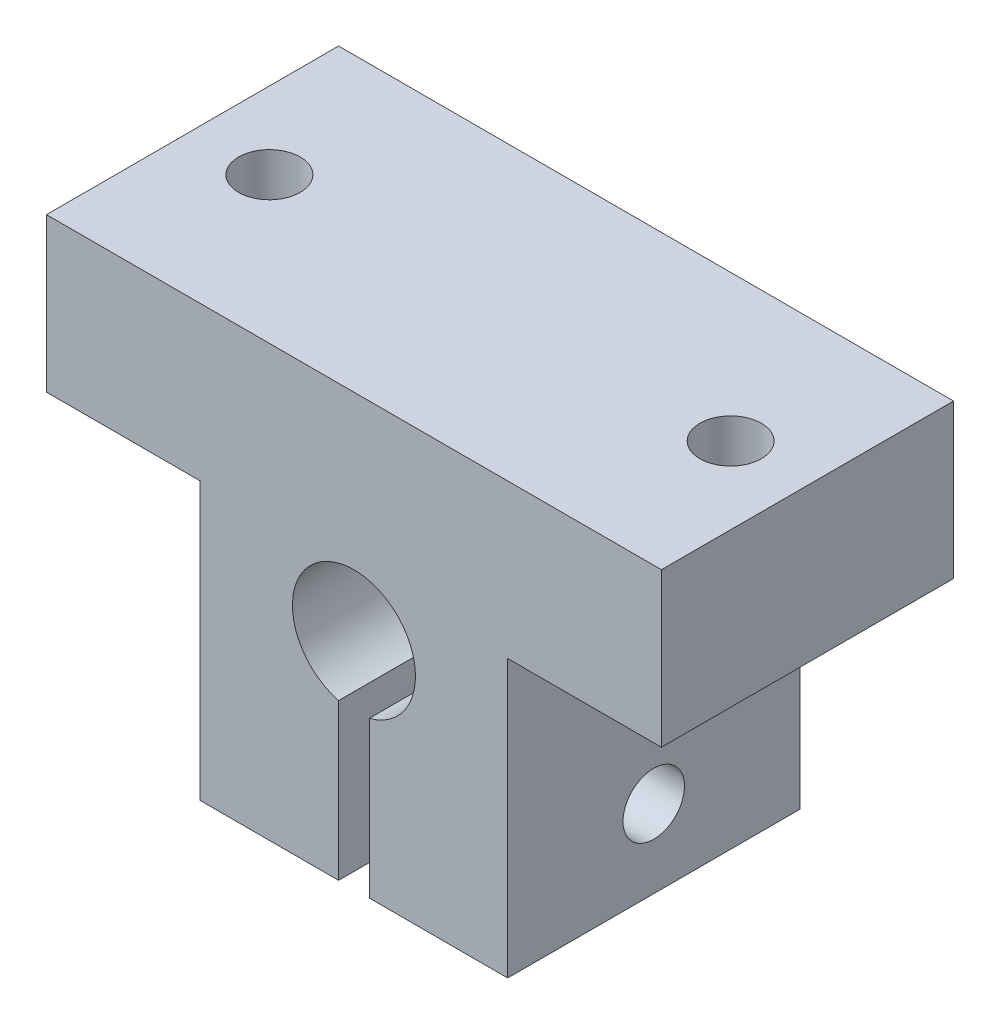
ISO-10303-21;
HEADER;
FILE_DESCRIPTION(('STEP AP214'),'2;1');
FILE_NAME('part.step','',(''),(''),'','','');
FILE_SCHEMA(('AUTOMOTIVE_DESIGN { 1 0 10303 214 1 1 1 1 }'));
ENDSEC;
DATA;
#1=APPLICATION_CONTEXT('core data for automotive mechanical design processes');
#2=APPLICATION_PROTOCOL_DEFINITION('international standard','automotive_design',2000,#1);
#3=PRODUCT_CONTEXT('',#1,'mechanical');
#4=PRODUCT('Part','Part','',(#3));
#5=PRODUCT_RELATED_PRODUCT_CATEGORY('part','',(#4));
#6=PRODUCT_DEFINITION_FORMATION('','',#4);
#7=PRODUCT_DEFINITION_CONTEXT('part definition',#1,'design');
#8=PRODUCT_DEFINITION('design','',#6,#7);
#9=PRODUCT_DEFINITION_SHAPE('','',#8);
#10=(LENGTH_UNIT() NAMED_UNIT(*) SI_UNIT(.MILLI.,.METRE.));
#11=(NAMED_UNIT(*) PLANE_ANGLE_UNIT() SI_UNIT($,.RADIAN.));
#12=(NAMED_UNIT(*) SI_UNIT($,.STERADIAN.) SOLID_ANGLE_UNIT());
#13=UNCERTAINTY_MEASURE_WITH_UNIT(LENGTH_MEASURE(1.E-05),#10,'distance_accuracy_value','');
#14=(GEOMETRIC_REPRESENTATION_CONTEXT(3) GLOBAL_UNCERTAINTY_ASSIGNED_CONTEXT((#13)) GLOBAL_UNIT_ASSIGNED_CONTEXT((#10,
#11,#12)) REPRESENTATION_CONTEXT('',''));
#15=CARTESIAN_POINT('',(0.,0.,0.));
#16=DIRECTION('',(0.,0.,1.));
#17=DIRECTION('',(1.,0.,0.));
#18=AXIS2_PLACEMENT_3D('',#15,#16,#17);
#19=CARTESIAN_POINT('',(80.0000000000009,-28.,19.));
#20=DIRECTION('',(0.,1.,0.));
#21=DIRECTION('',(-1.,0.,0.));
#22=AXIS2_PLACEMENT_3D('',#19,#20,#21);
#23=PLANE('',#22);
#24=DIRECTION('',(1.,0.,0.));
#25=VECTOR('',#24,1.);
#26=CARTESIAN_POINT('',(80.0000000000009,-28.,19.));
#27=LINE('',#26,#25);
#28=CARTESIAN_POINT('',(71.0000000000009,-28.,19.));
#29=VERTEX_POINT('',#28);
#30=CARTESIAN_POINT('',(80.0000000000009,-28.,19.));
#31=VERTEX_POINT('',#30);
#32=EDGE_CURVE('E241',#29,#31,#27,.T.);
#33=ORIENTED_EDGE('',*,*,#32,.F.);
#34=DIRECTION('',(0.,0.,-1.));
#35=VECTOR('',#34,1.);
#36=CARTESIAN_POINT('',(71.0000000000009,-28.,19.));
#37=LINE('',#36,#35);
#38=CARTESIAN_POINT('',(71.0000000000009,-28.,0.));
#39=VERTEX_POINT('',#38);
#40=EDGE_CURVE('E136',#29,#39,#37,.T.);
#41=ORIENTED_EDGE('',*,*,#40,.T.);
#42=DIRECTION('',(1.,0.,0.));
#43=VECTOR('',#42,1.);
#44=CARTESIAN_POINT('',(80.0000000000009,-28.,0.));
#45=LINE('',#44,#43);
#46=CARTESIAN_POINT('',(80.0000000000009,-28.,0.));
#47=VERTEX_POINT('',#46);
#48=EDGE_CURVE('E156',#39,#47,#45,.T.);
#49=ORIENTED_EDGE('',*,*,#48,.T.);
#50=DIRECTION('',(0.,0.,-1.));
#51=VECTOR('',#50,1.);
#52=CARTESIAN_POINT('',(80.0000000000009,-28.,19.));
#53=LINE('',#52,#51);
#54=EDGE_CURVE('E178',#31,#47,#53,.T.);
#55=ORIENTED_EDGE('',*,*,#54,.F.);
#56=EDGE_LOOP('',(#33,#41,#49,#55));
#57=FACE_BOUND('',#56,.T.);
#58=ADVANCED_FACE('F39',(#57),#23,.F.);
#59=CARTESIAN_POINT('',(0.,0.,19.));
#60=DIRECTION('',(0.,0.,-1.));
#61=DIRECTION('',(-1.,0.,0.));
#62=AXIS2_PLACEMENT_3D('',#59,#60,#61);
#63=PLANE('',#62);
#64=CARTESIAN_POINT('',(70.0000000000009,-14.,19.));
#65=DIRECTION('',(0.,0.,1.));
#66=DIRECTION('',(1.,0.,0.));
#67=AXIS2_PLACEMENT_3D('',#64,#65,#66);
#68=CIRCLE('',#67,4.00000000000001);
#69=CARTESIAN_POINT('',(71.0000000000009,-17.8729833462074,19.));
#70=VERTEX_POINT('',#69);
#71=CARTESIAN_POINT('',(69.0000000000009,-17.8729833462074,19.));
#72=VERTEX_POINT('',#71);
#73=EDGE_CURVE('E206',#70,#72,#68,.T.);
#74=ORIENTED_EDGE('',*,*,#73,.F.);
#75=DIRECTION('',(0.,1.,0.));
#76=VECTOR('',#75,1.);
#77=CARTESIAN_POINT('',(71.0000000000009,-40.7761479722693,19.));
#78=LINE('',#77,#76);
#79=EDGE_CURVE('E63',#29,#70,#78,.T.);
#80=ORIENTED_EDGE('',*,*,#79,.F.);
#81=ORIENTED_EDGE('',*,*,#32,.T.);
#82=DIRECTION('',(0.,1.,0.));
#83=VECTOR('',#82,1.);
#84=CARTESIAN_POINT('',(80.0000000000009,-10.,19.));
#85=LINE('',#84,#83);
#86=CARTESIAN_POINT('',(80.0000000000009,-10.,19.));
#87=VERTEX_POINT('',#86);
#88=EDGE_CURVE('E244',#31,#87,#85,.T.);
#89=ORIENTED_EDGE('',*,*,#88,.T.);
#90=DIRECTION('',(1.,0.,0.));
#91=VECTOR('',#90,1.);
#92=CARTESIAN_POINT('',(90.0000000000009,-10.,19.));
#93=LINE('',#92,#91);
#94=CARTESIAN_POINT('',(90.0000000000009,-10.,19.));
#95=VERTEX_POINT('',#94);
#96=EDGE_CURVE('E174',#87,#95,#93,.T.);
#97=ORIENTED_EDGE('',*,*,#96,.T.);
#98=DIRECTION('',(0.,1.,0.));
#99=VECTOR('',#98,1.);
#100=CARTESIAN_POINT('',(90.0000000000009,0.,19.));
#101=LINE('',#100,#99);
#102=CARTESIAN_POINT('',(90.0000000000009,0.,19.));
#103=VERTEX_POINT('',#102);
#104=EDGE_CURVE('E168',#95,#103,#101,.T.);
#105=ORIENTED_EDGE('',*,*,#104,.T.);
#106=DIRECTION('',(-1.,0.,0.));
#107=VECTOR('',#106,1.);
#108=CARTESIAN_POINT('',(50.0000000000009,0.,19.));
#109=LINE('',#108,#107);
#110=CARTESIAN_POINT('',(50.0000000000009,0.,19.));
#111=VERTEX_POINT('',#110);
#112=EDGE_CURVE('E229',#103,#111,#109,.T.);
#113=ORIENTED_EDGE('',*,*,#112,.T.);
#114=DIRECTION('',(0.,-1.,0.));
#115=VECTOR('',#114,1.);
#116=CARTESIAN_POINT('',(50.0000000000009,0.,19.));
#117=LINE('',#116,#115);
#118=CARTESIAN_POINT('',(50.0000000000009,-10.,19.));
#119=VERTEX_POINT('',#118);
#120=EDGE_CURVE('E232',#111,#119,#117,.T.);
#121=ORIENTED_EDGE('',*,*,#120,.T.);
#122=DIRECTION('',(1.,0.,0.));
#123=VECTOR('',#122,1.);
#124=CARTESIAN_POINT('',(60.0000000000009,-10.,19.));
#125=LINE('',#124,#123);
#126=CARTESIAN_POINT('',(60.0000000000009,-10.,19.));
#127=VERTEX_POINT('',#126);
#128=EDGE_CURVE('E235',#119,#127,#125,.T.);
#129=ORIENTED_EDGE('',*,*,#128,.T.);
#130=DIRECTION('',(0.,-1.,0.));
#131=VECTOR('',#130,1.);
#132=CARTESIAN_POINT('',(60.0000000000009,-28.,19.));
#133=LINE('',#132,#131);
#134=CARTESIAN_POINT('',(60.0000000000009,-28.,19.));
#135=VERTEX_POINT('',#134);
#136=EDGE_CURVE('E238',#127,#135,#133,.T.);
#137=ORIENTED_EDGE('',*,*,#136,.T.);
#138=CARTESIAN_POINT('',(69.0000000000009,-28.,19.));
#139=VERTEX_POINT('',#138);
#140=EDGE_CURVE('E207',#135,#139,#27,.T.);
#141=ORIENTED_EDGE('',*,*,#140,.T.);
#142=DIRECTION('',(0.,-1.,0.));
#143=VECTOR('',#142,1.);
#144=CARTESIAN_POINT('',(69.0000000000009,-40.7761479722693,19.));
#145=LINE('',#144,#143);
#146=EDGE_CURVE('E130',#72,#139,#145,.T.);
#147=ORIENTED_EDGE('',*,*,#146,.F.);
#148=EDGE_LOOP('',(#74,#80,#81,#89,#97,#105,#113,#121,#129,#137,#141,#147));
#149=FACE_BOUND('',#148,.T.);
#150=ADVANCED_FACE('F205',(#149),#63,.F.);
#151=CARTESIAN_POINT('',(0.,0.,0.));
#152=DIRECTION('',(0.,0.,-1.));
#153=DIRECTION('',(-1.,0.,0.));
#154=AXIS2_PLACEMENT_3D('',#151,#152,#153);
#155=PLANE('',#154);
#156=DIRECTION('',(0.,1.,0.));
#157=VECTOR('',#156,1.);
#158=CARTESIAN_POINT('',(71.0000000000009,-40.7761479722693,0.));
#159=LINE('',#158,#157);
#160=CARTESIAN_POINT('',(71.0000000000009,-17.8729833462074,0.));
#161=VERTEX_POINT('',#160);
#162=EDGE_CURVE('E148',#39,#161,#159,.T.);
#163=ORIENTED_EDGE('',*,*,#162,.T.);
#164=CARTESIAN_POINT('',(70.0000000000009,-14.,0.));
#165=DIRECTION('',(0.,0.,1.));
#166=DIRECTION('',(1.,0.,0.));
#167=AXIS2_PLACEMENT_3D('',#164,#165,#166);
#168=CIRCLE('',#167,4.00000000000001);
#169=CARTESIAN_POINT('',(69.0000000000009,-17.8729833462074,0.));
#170=VERTEX_POINT('',#169);
#171=EDGE_CURVE('E146',#161,#170,#168,.T.);
#172=ORIENTED_EDGE('',*,*,#171,.T.);
#173=DIRECTION('',(0.,-1.,0.));
#174=VECTOR('',#173,1.);
#175=CARTESIAN_POINT('',(69.0000000000009,-40.7761479722693,0.));
#176=LINE('',#175,#174);
#177=CARTESIAN_POINT('',(69.0000000000009,-28.,0.));
#178=VERTEX_POINT('',#177);
#179=EDGE_CURVE('E56',#170,#178,#176,.T.);
#180=ORIENTED_EDGE('',*,*,#179,.T.);
#181=CARTESIAN_POINT('',(60.0000000000009,-28.,0.));
#182=VERTEX_POINT('',#181);
#183=EDGE_CURVE('E144',#182,#178,#45,.T.);
#184=ORIENTED_EDGE('',*,*,#183,.F.);
#185=DIRECTION('',(0.,-1.,0.));
#186=VECTOR('',#185,1.);
#187=CARTESIAN_POINT('',(60.0000000000009,-28.,0.));
#188=LINE('',#187,#186);
#189=CARTESIAN_POINT('',(60.0000000000009,-10.,0.));
#190=VERTEX_POINT('',#189);
#191=EDGE_CURVE('E162',#190,#182,#188,.T.);
#192=ORIENTED_EDGE('',*,*,#191,.F.);
#193=DIRECTION('',(1.,0.,0.));
#194=VECTOR('',#193,1.);
#195=CARTESIAN_POINT('',(60.0000000000009,-10.,0.));
#196=LINE('',#195,#194);
#197=CARTESIAN_POINT('',(50.0000000000009,-10.,0.));
#198=VERTEX_POINT('',#197);
#199=EDGE_CURVE('E253',#198,#190,#196,.T.);
#200=ORIENTED_EDGE('',*,*,#199,.F.);
#201=DIRECTION('',(0.,-1.,0.));
#202=VECTOR('',#201,1.);
#203=CARTESIAN_POINT('',(50.0000000000009,0.,0.));
#204=LINE('',#203,#202);
#205=CARTESIAN_POINT('',(50.0000000000009,0.,0.));
#206=VERTEX_POINT('',#205);
#207=EDGE_CURVE('E251',#206,#198,#204,.T.);
#208=ORIENTED_EDGE('',*,*,#207,.F.);
#209=DIRECTION('',(-1.,0.,0.));
#210=VECTOR('',#209,1.);
#211=CARTESIAN_POINT('',(50.0000000000009,0.,0.));
#212=LINE('',#211,#210);
#213=CARTESIAN_POINT('',(90.0000000000009,0.,0.));
#214=VERTEX_POINT('',#213);
#215=EDGE_CURVE('E218',#214,#206,#212,.T.);
#216=ORIENTED_EDGE('',*,*,#215,.F.);
#217=DIRECTION('',(0.,1.,0.));
#218=VECTOR('',#217,1.);
#219=CARTESIAN_POINT('',(90.0000000000009,0.,0.));
#220=LINE('',#219,#218);
#221=CARTESIAN_POINT('',(90.0000000000009,-10.,0.));
#222=VERTEX_POINT('',#221);
#223=EDGE_CURVE('E213',#222,#214,#220,.T.);
#224=ORIENTED_EDGE('',*,*,#223,.F.);
#225=DIRECTION('',(1.,0.,0.));
#226=VECTOR('',#225,1.);
#227=CARTESIAN_POINT('',(90.0000000000009,-10.,0.));
#228=LINE('',#227,#226);
#229=CARTESIAN_POINT('',(80.0000000000009,-10.,0.));
#230=VERTEX_POINT('',#229);
#231=EDGE_CURVE('E160',#230,#222,#228,.T.);
#232=ORIENTED_EDGE('',*,*,#231,.F.);
#233=DIRECTION('',(0.,1.,0.));
#234=VECTOR('',#233,1.);
#235=CARTESIAN_POINT('',(80.0000000000009,-10.,0.));
#236=LINE('',#235,#234);
#237=EDGE_CURVE('E155',#47,#230,#236,.T.);
#238=ORIENTED_EDGE('',*,*,#237,.F.);
#239=ORIENTED_EDGE('',*,*,#48,.F.);
#240=EDGE_LOOP('',(#163,#172,#180,#184,#192,#200,#208,#216,#224,#232,#238,#239));
#241=FACE_BOUND('',#240,.T.);
#242=ADVANCED_FACE('F142',(#241),#155,.T.);
#243=CARTESIAN_POINT('',(90.0000000000009,0.,19.));
#244=DIRECTION('',(-1.,0.,0.));
#245=DIRECTION('',(0.,-1.,0.));
#246=AXIS2_PLACEMENT_3D('',#243,#244,#245);
#247=PLANE('',#246);
#248=ORIENTED_EDGE('',*,*,#223,.T.);
#249=DIRECTION('',(0.,0.,-1.));
#250=VECTOR('',#249,1.);
#251=CARTESIAN_POINT('',(90.0000000000009,0.,19.));
#252=LINE('',#251,#250);
#253=EDGE_CURVE('E196',#103,#214,#252,.T.);
#254=ORIENTED_EDGE('',*,*,#253,.F.);
#255=ORIENTED_EDGE('',*,*,#104,.F.);
#256=DIRECTION('',(0.,0.,-1.));
#257=VECTOR('',#256,1.);
#258=CARTESIAN_POINT('',(90.0000000000009,-10.,19.));
#259=LINE('',#258,#257);
#260=EDGE_CURVE('E169',#95,#222,#259,.T.);
#261=ORIENTED_EDGE('',*,*,#260,.T.);
#262=EDGE_LOOP('',(#248,#254,#255,#261));
#263=FACE_BOUND('',#262,.T.);
#264=ADVANCED_FACE('F41',(#263),#247,.F.);
#265=CARTESIAN_POINT('',(50.0000000000009,0.,19.));
#266=DIRECTION('',(0.,-1.,0.));
#267=DIRECTION('',(1.,0.,0.));
#268=AXIS2_PLACEMENT_3D('',#265,#266,#267);
#269=PLANE('',#268);
#270=CARTESIAN_POINT('',(85.0000000000009,0.,9.5));
#271=DIRECTION('',(0.,-1.,0.));
#272=DIRECTION('',(1.,0.,0.));
#273=AXIS2_PLACEMENT_3D('',#270,#271,#272);
#274=CIRCLE('',#273,2.);
#275=CARTESIAN_POINT('',(87.0000000000009,0.,9.5));
#276=VERTEX_POINT('',#275);
#277=EDGE_CURVE('E220',#276,#276,#274,.F.);
#278=ORIENTED_EDGE('',*,*,#277,.F.);
#279=EDGE_LOOP('',(#278));
#280=FACE_BOUND('',#279,.T.);
#281=CARTESIAN_POINT('',(55.0000000000009,0.,9.5));
#282=DIRECTION('',(0.,-1.,0.));
#283=DIRECTION('',(1.,0.,0.));
#284=AXIS2_PLACEMENT_3D('',#281,#282,#283);
#285=CIRCLE('',#284,2.);
#286=CARTESIAN_POINT('',(57.0000000000009,0.,9.5));
#287=VERTEX_POINT('',#286);
#288=EDGE_CURVE('E223',#287,#287,#285,.F.);
#289=ORIENTED_EDGE('',*,*,#288,.F.);
#290=EDGE_LOOP('',(#289));
#291=FACE_BOUND('',#290,.T.);
#292=ORIENTED_EDGE('',*,*,#215,.T.);
#293=DIRECTION('',(0.,0.,-1.));
#294=VECTOR('',#293,1.);
#295=CARTESIAN_POINT('',(50.0000000000009,0.,19.));
#296=LINE('',#295,#294);
#297=EDGE_CURVE('E192',#111,#206,#296,.T.);
#298=ORIENTED_EDGE('',*,*,#297,.F.);
#299=ORIENTED_EDGE('',*,*,#112,.F.);
#300=ORIENTED_EDGE('',*,*,#253,.T.);
#301=EDGE_LOOP('',(#292,#298,#299,#300));
#302=FACE_BOUND('',#301,.T.);
#303=ADVANCED_FACE('F274',(#280,#291,#302),#269,.F.);
#304=CARTESIAN_POINT('',(50.0000000000009,0.,19.));
#305=DIRECTION('',(1.,0.,0.));
#306=DIRECTION('',(0.,1.,0.));
#307=AXIS2_PLACEMENT_3D('',#304,#305,#306);
#308=PLANE('',#307);
#309=ORIENTED_EDGE('',*,*,#207,.T.);
#310=DIRECTION('',(0.,0.,-1.));
#311=VECTOR('',#310,1.);
#312=CARTESIAN_POINT('',(50.0000000000009,-10.,19.));
#313=LINE('',#312,#311);
#314=EDGE_CURVE('E188',#119,#198,#313,.T.);
#315=ORIENTED_EDGE('',*,*,#314,.F.);
#316=ORIENTED_EDGE('',*,*,#120,.F.);
#317=ORIENTED_EDGE('',*,*,#297,.T.);
#318=EDGE_LOOP('',(#309,#315,#316,#317));
#319=FACE_BOUND('',#318,.T.);
#320=ADVANCED_FACE('F266',(#319),#308,.F.);
#321=CARTESIAN_POINT('',(60.0000000000009,-10.,19.));
#322=DIRECTION('',(0.,1.,0.));
#323=DIRECTION('',(0.,0.,1.));
#324=AXIS2_PLACEMENT_3D('',#321,#322,#323);
#325=PLANE('',#324);
#326=CARTESIAN_POINT('',(55.0000000000009,-10.,9.5));
#327=DIRECTION('',(0.,-1.,0.));
#328=DIRECTION('',(0.,0.,-1.));
#329=AXIS2_PLACEMENT_3D('',#326,#327,#328);
#330=CIRCLE('',#329,2.);
#331=CARTESIAN_POINT('',(55.0000000000009,-10.,7.5));
#332=VERTEX_POINT('',#331);
#333=EDGE_CURVE('E298',#332,#332,#330,.T.);
#334=ORIENTED_EDGE('',*,*,#333,.F.);
#335=EDGE_LOOP('',(#334));
#336=FACE_BOUND('',#335,.T.);
#337=ORIENTED_EDGE('',*,*,#199,.T.);
#338=DIRECTION('',(0.,0.,-1.));
#339=VECTOR('',#338,1.);
#340=CARTESIAN_POINT('',(60.0000000000009,-10.,19.));
#341=LINE('',#340,#339);
#342=EDGE_CURVE('E184',#127,#190,#341,.T.);
#343=ORIENTED_EDGE('',*,*,#342,.F.);
#344=ORIENTED_EDGE('',*,*,#128,.F.);
#345=ORIENTED_EDGE('',*,*,#314,.T.);
#346=EDGE_LOOP('',(#337,#343,#344,#345));
#347=FACE_BOUND('',#346,.T.);
#348=ADVANCED_FACE('F270',(#336,#347),#325,.F.);
#349=CARTESIAN_POINT('',(60.0000000000009,-28.,19.));
#350=DIRECTION('',(1.,0.,0.));
#351=DIRECTION('',(0.,0.,-1.));
#352=AXIS2_PLACEMENT_3D('',#349,#350,#351);
#353=PLANE('',#352);
#354=CARTESIAN_POINT('',(60.0000000000009,-22.9364916731037,9.5));
#355=DIRECTION('',(1.,0.,0.));
#356=DIRECTION('',(0.,0.,-1.));
#357=AXIS2_PLACEMENT_3D('',#354,#355,#356);
#358=CIRCLE('',#357,2.);
#359=CARTESIAN_POINT('',(60.0000000000009,-22.9364916731037,7.5));
#360=VERTEX_POINT('',#359);
#361=EDGE_CURVE('E209',#360,#360,#358,.T.);
#362=ORIENTED_EDGE('',*,*,#361,.T.);
#363=EDGE_LOOP('',(#362));
#364=FACE_BOUND('',#363,.T.);
#365=ORIENTED_EDGE('',*,*,#191,.T.);
#366=DIRECTION('',(0.,0.,-1.));
#367=VECTOR('',#366,1.);
#368=CARTESIAN_POINT('',(60.0000000000009,-28.,19.));
#369=LINE('',#368,#367);
#370=EDGE_CURVE('E153',#135,#182,#369,.T.);
#371=ORIENTED_EDGE('',*,*,#370,.F.);
#372=ORIENTED_EDGE('',*,*,#136,.F.);
#373=ORIENTED_EDGE('',*,*,#342,.T.);
#374=EDGE_LOOP('',(#365,#371,#372,#373));
#375=FACE_BOUND('',#374,.T.);
#376=ADVANCED_FACE('F260',(#364,#375),#353,.F.);
#377=ORIENTED_EDGE('',*,*,#183,.T.);
#378=DIRECTION('',(0.,0.,1.));
#379=VECTOR('',#378,1.);
#380=CARTESIAN_POINT('',(69.0000000000009,-28.,19.));
#381=LINE('',#380,#379);
#382=EDGE_CURVE('E127',#178,#139,#381,.T.);
#383=ORIENTED_EDGE('',*,*,#382,.T.);
#384=ORIENTED_EDGE('',*,*,#140,.F.);
#385=ORIENTED_EDGE('',*,*,#370,.T.);
#386=EDGE_LOOP('',(#377,#383,#384,#385));
#387=FACE_BOUND('',#386,.T.);
#388=ADVANCED_FACE('F151',(#387),#23,.F.);
#389=CARTESIAN_POINT('',(80.0000000000009,-10.,19.));
#390=DIRECTION('',(-1.,0.,0.));
#391=DIRECTION('',(0.,0.,1.));
#392=AXIS2_PLACEMENT_3D('',#389,#390,#391);
#393=PLANE('',#392);
#394=CARTESIAN_POINT('',(80.0000000000009,-22.9364916731037,9.5));
#395=DIRECTION('',(-1.,0.,0.));
#396=DIRECTION('',(0.,0.,1.));
#397=AXIS2_PLACEMENT_3D('',#394,#395,#396);
#398=CIRCLE('',#397,2.);
#399=CARTESIAN_POINT('',(80.0000000000009,-22.9364916731037,11.5));
#400=VERTEX_POINT('',#399);
#401=EDGE_CURVE('E347',#400,#400,#398,.T.);
#402=ORIENTED_EDGE('',*,*,#401,.T.);
#403=EDGE_LOOP('',(#402));
#404=FACE_BOUND('',#403,.T.);
#405=ORIENTED_EDGE('',*,*,#237,.T.);
#406=DIRECTION('',(0.,0.,-1.));
#407=VECTOR('',#406,1.);
#408=CARTESIAN_POINT('',(80.0000000000009,-10.,19.));
#409=LINE('',#408,#407);
#410=EDGE_CURVE('E173',#87,#230,#409,.T.);
#411=ORIENTED_EDGE('',*,*,#410,.F.);
#412=ORIENTED_EDGE('',*,*,#88,.F.);
#413=ORIENTED_EDGE('',*,*,#54,.T.);
#414=EDGE_LOOP('',(#405,#411,#412,#413));
#415=FACE_BOUND('',#414,.T.);
#416=ADVANCED_FACE('F286',(#404,#415),#393,.F.);
#417=CARTESIAN_POINT('',(90.0000000000009,-10.,19.));
#418=DIRECTION('',(0.,1.,0.));
#419=DIRECTION('',(-1.,0.,0.));
#420=AXIS2_PLACEMENT_3D('',#417,#418,#419);
#421=PLANE('',#420);
#422=CARTESIAN_POINT('',(85.0000000000009,-10.,9.5));
#423=DIRECTION('',(0.,-1.,0.));
#424=DIRECTION('',(0.,0.,-1.));
#425=AXIS2_PLACEMENT_3D('',#422,#423,#424);
#426=CIRCLE('',#425,2.);
#427=CARTESIAN_POINT('',(85.0000000000009,-10.,7.50000000000001));
#428=VERTEX_POINT('',#427);
#429=EDGE_CURVE('E299',#428,#428,#426,.T.);
#430=ORIENTED_EDGE('',*,*,#429,.F.);
#431=EDGE_LOOP('',(#430));
#432=FACE_BOUND('',#431,.T.);
#433=ORIENTED_EDGE('',*,*,#231,.T.);
#434=ORIENTED_EDGE('',*,*,#260,.F.);
#435=ORIENTED_EDGE('',*,*,#96,.F.);
#436=ORIENTED_EDGE('',*,*,#410,.T.);
#437=EDGE_LOOP('',(#433,#434,#435,#436));
#438=FACE_BOUND('',#437,.T.);
#439=ADVANCED_FACE('F281',(#432,#438),#421,.F.);
#440=CARTESIAN_POINT('',(70.0000000000009,-14.,19.));
#441=DIRECTION('',(0.,0.,-1.));
#442=DIRECTION('',(-1.,0.,0.));
#443=AXIS2_PLACEMENT_3D('',#440,#441,#442);
#444=CYLINDRICAL_SURFACE('',#443,4.00000000000001);
#445=DIRECTION('',(0.,0.,-1.));
#446=VECTOR('',#445,1.);
#447=CARTESIAN_POINT('',(71.0000000000009,-17.8729833462074,19.));
#448=LINE('',#447,#446);
#449=EDGE_CURVE('E11',#70,#161,#448,.T.);
#450=ORIENTED_EDGE('',*,*,#449,.F.);
#451=ORIENTED_EDGE('',*,*,#73,.T.);
#452=DIRECTION('',(0.,0.,-1.));
#453=VECTOR('',#452,1.);
#454=CARTESIAN_POINT('',(69.0000000000009,-17.8729833462074,19.));
#455=LINE('',#454,#453);
#456=EDGE_CURVE('E49',#170,#72,#455,.F.);
#457=ORIENTED_EDGE('',*,*,#456,.F.);
#458=ORIENTED_EDGE('',*,*,#171,.F.);
#459=EDGE_LOOP('',(#450,#451,#457,#458));
#460=FACE_BOUND('',#459,.T.);
#461=ADVANCED_FACE('F211',(#460),#444,.F.);
#462=CARTESIAN_POINT('',(85.0000000000009,5.65685424949239,9.5));
#463=DIRECTION('',(0.,-1.,0.));
#464=DIRECTION('',(0.,0.,-1.));
#465=AXIS2_PLACEMENT_3D('',#462,#463,#464);
#466=CYLINDRICAL_SURFACE('',#465,2.);
#467=ORIENTED_EDGE('',*,*,#277,.T.);
#468=EDGE_LOOP('',(#467));
#469=FACE_BOUND('',#468,.T.);
#470=ORIENTED_EDGE('',*,*,#429,.T.);
#471=EDGE_LOOP('',(#470));
#472=FACE_BOUND('',#471,.T.);
#473=ADVANCED_FACE('F379',(#469,#472),#466,.F.);
#474=CARTESIAN_POINT('',(55.0000000000009,5.65685424949239,9.5));
#475=DIRECTION('',(0.,-1.,0.));
#476=DIRECTION('',(0.,0.,-1.));
#477=AXIS2_PLACEMENT_3D('',#474,#475,#476);
#478=CYLINDRICAL_SURFACE('',#477,2.);
#479=ORIENTED_EDGE('',*,*,#288,.T.);
#480=EDGE_LOOP('',(#479));
#481=FACE_BOUND('',#480,.T.);
#482=ORIENTED_EDGE('',*,*,#333,.T.);
#483=EDGE_LOOP('',(#482));
#484=FACE_BOUND('',#483,.T.);
#485=ADVANCED_FACE('F313',(#481,#484),#478,.F.);
#486=CARTESIAN_POINT('',(69.0000000000009,-40.7761479722693,-25.6304472851582));
#487=DIRECTION('',(-1.,0.,0.));
#488=DIRECTION('',(0.,0.,1.));
#489=AXIS2_PLACEMENT_3D('',#486,#487,#488);
#490=PLANE('',#489);
#491=CARTESIAN_POINT('',(69.0000000000009,-22.9364916731037,9.5));
#492=DIRECTION('',(-1.,0.,0.));
#493=DIRECTION('',(0.,0.,1.));
#494=AXIS2_PLACEMENT_3D('',#491,#492,#493);
#495=CIRCLE('',#494,2.);
#496=CARTESIAN_POINT('',(69.0000000000009,-22.9364916731037,11.5));
#497=VERTEX_POINT('',#496);
#498=EDGE_CURVE('E351',#497,#497,#495,.T.);
#499=ORIENTED_EDGE('',*,*,#498,.T.);
#500=EDGE_LOOP('',(#499));
#501=FACE_BOUND('',#500,.T.);
#502=ORIENTED_EDGE('',*,*,#179,.F.);
#503=ORIENTED_EDGE('',*,*,#456,.T.);
#504=ORIENTED_EDGE('',*,*,#146,.T.);
#505=ORIENTED_EDGE('',*,*,#382,.F.);
#506=EDGE_LOOP('',(#502,#503,#504,#505));
#507=FACE_BOUND('',#506,.T.);
#508=ADVANCED_FACE('F128',(#501,#507),#490,.F.);
#509=CARTESIAN_POINT('',(71.0000000000009,-40.7761479722693,-25.6304472851582));
#510=DIRECTION('',(1.,0.,0.));
#511=DIRECTION('',(0.,0.,-1.));
#512=AXIS2_PLACEMENT_3D('',#509,#510,#511);
#513=PLANE('',#512);
#514=CARTESIAN_POINT('',(71.0000000000009,-22.9364916731037,9.5));
#515=DIRECTION('',(1.,0.,0.));
#516=DIRECTION('',(0.,0.,-1.));
#517=AXIS2_PLACEMENT_3D('',#514,#515,#516);
#518=CIRCLE('',#517,2.);
#519=CARTESIAN_POINT('',(71.0000000000009,-22.9364916731037,7.5));
#520=VERTEX_POINT('',#519);
#521=EDGE_CURVE('E43',#520,#520,#518,.T.);
#522=ORIENTED_EDGE('',*,*,#521,.T.);
#523=EDGE_LOOP('',(#522));
#524=FACE_BOUND('',#523,.T.);
#525=ORIENTED_EDGE('',*,*,#79,.T.);
#526=ORIENTED_EDGE('',*,*,#449,.T.);
#527=ORIENTED_EDGE('',*,*,#162,.F.);
#528=ORIENTED_EDGE('',*,*,#40,.F.);
#529=EDGE_LOOP('',(#525,#526,#527,#528));
#530=FACE_BOUND('',#529,.T.);
#531=ADVANCED_FACE('F362',(#524,#530),#513,.F.);
#532=CARTESIAN_POINT('',(90.0000000000009,-22.9364916731037,9.5));
#533=DIRECTION('',(-1.,0.,0.));
#534=DIRECTION('',(0.,0.,1.));
#535=AXIS2_PLACEMENT_3D('',#532,#533,#534);
#536=CYLINDRICAL_SURFACE('',#535,2.);
#537=ORIENTED_EDGE('',*,*,#521,.F.);
#538=EDGE_LOOP('',(#537));
#539=FACE_BOUND('',#538,.T.);
#540=ORIENTED_EDGE('',*,*,#401,.F.);
#541=EDGE_LOOP('',(#540));
#542=FACE_BOUND('',#541,.T.);
#543=ADVANCED_FACE('F364',(#539,#542),#536,.F.);
#544=ORIENTED_EDGE('',*,*,#498,.F.);
#545=EDGE_LOOP('',(#544));
#546=FACE_BOUND('',#545,.T.);
#547=ORIENTED_EDGE('',*,*,#361,.F.);
#548=EDGE_LOOP('',(#547));
#549=FACE_BOUND('',#548,.T.);
#550=ADVANCED_FACE('F367',(#546,#549),#536,.F.);
#551=CLOSED_SHELL('',(#58,#150,#242,#264,#303,#320,#348,#376,#388,#416,#439,#461,#473,#485,#508,
#531,#543,#550));
#552=MANIFOLD_SOLID_BREP('B2',#551);
#553=ADVANCED_BREP_SHAPE_REPRESENTATION('',(#18,#552),#14);
#554=SHAPE_DEFINITION_REPRESENTATION(#9,#553);
ENDSEC;
END-ISO-10303-21;
